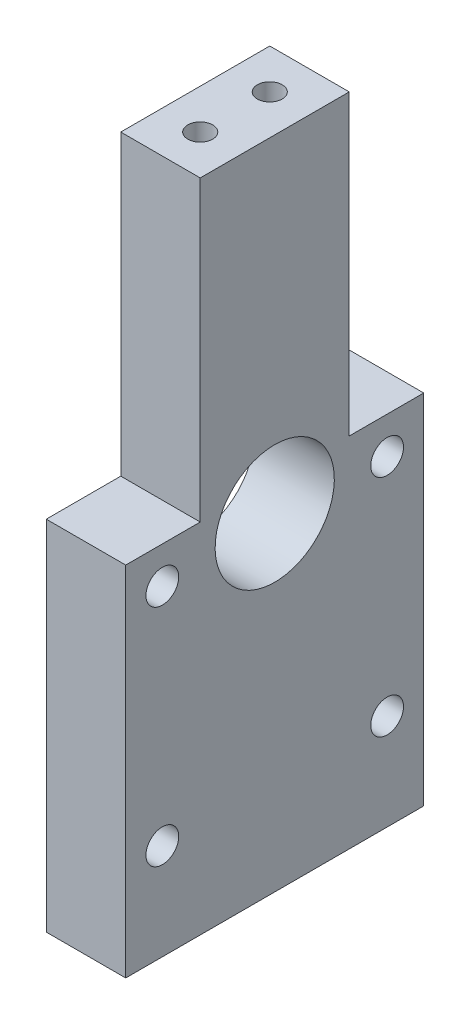
ISO-10303-21;
HEADER;
FILE_DESCRIPTION(('STEP AP214'),'2;1');
FILE_NAME('part.step','',(''),(''),'','','');
FILE_SCHEMA(('AUTOMOTIVE_DESIGN { 1 0 10303 214 1 1 1 1 }'));
ENDSEC;
DATA;
#1=APPLICATION_CONTEXT('core data for automotive mechanical design processes');
#2=APPLICATION_PROTOCOL_DEFINITION('international standard','automotive_design',2000,#1);
#3=PRODUCT_CONTEXT('',#1,'mechanical');
#4=PRODUCT('Part','Part','',(#3));
#5=PRODUCT_RELATED_PRODUCT_CATEGORY('part','',(#4));
#6=PRODUCT_DEFINITION_FORMATION('','',#4);
#7=PRODUCT_DEFINITION_CONTEXT('part definition',#1,'design');
#8=PRODUCT_DEFINITION('design','',#6,#7);
#9=PRODUCT_DEFINITION_SHAPE('','',#8);
#10=(LENGTH_UNIT() NAMED_UNIT(*) SI_UNIT(.MILLI.,.METRE.));
#11=(NAMED_UNIT(*) PLANE_ANGLE_UNIT() SI_UNIT($,.RADIAN.));
#12=(NAMED_UNIT(*) SI_UNIT($,.STERADIAN.) SOLID_ANGLE_UNIT());
#13=UNCERTAINTY_MEASURE_WITH_UNIT(LENGTH_MEASURE(1.E-05),#10,'distance_accuracy_value','');
#14=(GEOMETRIC_REPRESENTATION_CONTEXT(3) GLOBAL_UNCERTAINTY_ASSIGNED_CONTEXT((#13)) GLOBAL_UNIT_ASSIGNED_CONTEXT((#10,
#11,#12)) REPRESENTATION_CONTEXT('',''));
#15=CARTESIAN_POINT('',(0.,0.,0.));
#16=DIRECTION('',(0.,0.,1.));
#17=DIRECTION('',(1.,0.,0.));
#18=AXIS2_PLACEMENT_3D('',#15,#16,#17);
#19=CARTESIAN_POINT('',(0.,0.,30.));
#20=DIRECTION('',(0.,0.,1.));
#21=DIRECTION('',(1.,0.,0.));
#22=AXIS2_PLACEMENT_3D('',#19,#20,#21);
#23=PLANE('',#22);
#24=DIRECTION('',(0.,1.,0.));
#25=VECTOR('',#24,1.);
#26=CARTESIAN_POINT('',(18.,-11.,30.));
#27=LINE('',#26,#25);
#28=CARTESIAN_POINT('',(18.,-77.,30.));
#29=VERTEX_POINT('',#28);
#30=CARTESIAN_POINT('',(18.,-41.,30.));
#31=VERTEX_POINT('',#30);
#32=EDGE_CURVE('E213',#29,#31,#27,.T.);
#33=ORIENTED_EDGE('',*,*,#32,.T.);
#34=DIRECTION('',(1.,0.,0.));
#35=VECTOR('',#34,1.);
#36=CARTESIAN_POINT('',(18.,-41.,30.));
#37=LINE('',#36,#35);
#38=CARTESIAN_POINT('',(10.,-41.,30.));
#39=VERTEX_POINT('',#38);
#40=EDGE_CURVE('E156',#39,#31,#37,.T.);
#41=ORIENTED_EDGE('',*,*,#40,.F.);
#42=DIRECTION('',(0.,-1.,0.));
#43=VECTOR('',#42,1.);
#44=CARTESIAN_POINT('',(10.,-11.,30.));
#45=LINE('',#44,#43);
#46=CARTESIAN_POINT('',(10.,-77.,30.));
#47=VERTEX_POINT('',#46);
#48=EDGE_CURVE('E208',#39,#47,#45,.T.);
#49=ORIENTED_EDGE('',*,*,#48,.T.);
#50=DIRECTION('',(1.,0.,0.));
#51=VECTOR('',#50,1.);
#52=CARTESIAN_POINT('',(10.,-77.,30.));
#53=LINE('',#52,#51);
#54=EDGE_CURVE('E210',#47,#29,#53,.T.);
#55=ORIENTED_EDGE('',*,*,#54,.T.);
#56=EDGE_LOOP('',(#33,#41,#49,#55));
#57=FACE_BOUND('',#56,.T.);
#58=ADVANCED_FACE('F44',(#57),#23,.T.);
#59=CARTESIAN_POINT('',(0.,0.,0.));
#60=DIRECTION('',(0.,0.,1.));
#61=DIRECTION('',(1.,0.,0.));
#62=AXIS2_PLACEMENT_3D('',#59,#60,#61);
#63=PLANE('',#62);
#64=DIRECTION('',(-1.,0.,0.));
#65=VECTOR('',#64,1.);
#66=CARTESIAN_POINT('',(10.,-41.,0.));
#67=LINE('',#66,#65);
#68=CARTESIAN_POINT('',(18.,-41.,0.));
#69=VERTEX_POINT('',#68);
#70=CARTESIAN_POINT('',(10.,-41.,0.));
#71=VERTEX_POINT('',#70);
#72=EDGE_CURVE('E134',#69,#71,#67,.T.);
#73=ORIENTED_EDGE('',*,*,#72,.F.);
#74=DIRECTION('',(0.,1.,0.));
#75=VECTOR('',#74,1.);
#76=CARTESIAN_POINT('',(18.,-11.,0.));
#77=LINE('',#76,#75);
#78=CARTESIAN_POINT('',(18.,-77.,0.));
#79=VERTEX_POINT('',#78);
#80=EDGE_CURVE('E211',#79,#69,#77,.T.);
#81=ORIENTED_EDGE('',*,*,#80,.F.);
#82=DIRECTION('',(1.,0.,0.));
#83=VECTOR('',#82,1.);
#84=CARTESIAN_POINT('',(10.,-77.,0.));
#85=LINE('',#84,#83);
#86=CARTESIAN_POINT('',(10.,-77.,0.));
#87=VERTEX_POINT('',#86);
#88=EDGE_CURVE('E218',#87,#79,#85,.T.);
#89=ORIENTED_EDGE('',*,*,#88,.F.);
#90=DIRECTION('',(0.,-1.,0.));
#91=VECTOR('',#90,1.);
#92=CARTESIAN_POINT('',(10.,-11.,0.));
#93=LINE('',#92,#91);
#94=EDGE_CURVE('E216',#71,#87,#93,.T.);
#95=ORIENTED_EDGE('',*,*,#94,.F.);
#96=EDGE_LOOP('',(#73,#81,#89,#95));
#97=FACE_BOUND('',#96,.T.);
#98=ADVANCED_FACE('F237',(#97),#63,.F.);
#99=CARTESIAN_POINT('',(10.,-11.,30.));
#100=DIRECTION('',(1.,0.,0.));
#101=DIRECTION('',(0.,1.,0.));
#102=AXIS2_PLACEMENT_3D('',#99,#100,#101);
#103=PLANE('',#102);
#104=CARTESIAN_POINT('',(10.,-44.,15.));
#105=DIRECTION('',(1.,0.,0.));
#106=DIRECTION('',(0.,1.,0.));
#107=AXIS2_PLACEMENT_3D('',#104,#105,#106);
#108=CIRCLE('',#107,6.);
#109=CARTESIAN_POINT('',(10.,-38.,15.));
#110=VERTEX_POINT('',#109);
#111=EDGE_CURVE('E160',#110,#110,#108,.T.);
#112=ORIENTED_EDGE('',*,*,#111,.T.);
#113=EDGE_LOOP('',(#112));
#114=FACE_BOUND('',#113,.T.);
#115=CARTESIAN_POINT('',(10.,-44.6862915010152,3.68629150101527));
#116=DIRECTION('',(1.,0.,0.));
#117=DIRECTION('',(0.,1.,0.));
#118=AXIS2_PLACEMENT_3D('',#115,#116,#117);
#119=CIRCLE('',#118,1.65);
#120=CARTESIAN_POINT('',(10.,-43.0362915010152,3.68629150101527));
#121=VERTEX_POINT('',#120);
#122=EDGE_CURVE('E190',#121,#121,#119,.T.);
#123=ORIENTED_EDGE('',*,*,#122,.T.);
#124=EDGE_LOOP('',(#123));
#125=FACE_BOUND('',#124,.T.);
#126=CARTESIAN_POINT('',(10.,-67.3137084989848,3.68629150101527));
#127=DIRECTION('',(1.,0.,0.));
#128=DIRECTION('',(0.,1.,0.));
#129=AXIS2_PLACEMENT_3D('',#126,#127,#128);
#130=CIRCLE('',#129,1.64999999999999);
#131=CARTESIAN_POINT('',(10.,-65.6637084989848,3.68629150101527));
#132=VERTEX_POINT('',#131);
#133=EDGE_CURVE('E196',#132,#132,#130,.T.);
#134=ORIENTED_EDGE('',*,*,#133,.T.);
#135=EDGE_LOOP('',(#134));
#136=FACE_BOUND('',#135,.T.);
#137=CARTESIAN_POINT('',(10.,-67.3137084989848,26.3137084989847));
#138=DIRECTION('',(1.,0.,0.));
#139=DIRECTION('',(0.,1.,0.));
#140=AXIS2_PLACEMENT_3D('',#137,#138,#139);
#141=CIRCLE('',#140,1.64999999999999);
#142=CARTESIAN_POINT('',(10.,-65.6637084989848,26.3137084989847));
#143=VERTEX_POINT('',#142);
#144=EDGE_CURVE('E202',#143,#143,#141,.T.);
#145=ORIENTED_EDGE('',*,*,#144,.T.);
#146=EDGE_LOOP('',(#145));
#147=FACE_BOUND('',#146,.T.);
#148=CARTESIAN_POINT('',(10.,-44.6862915010152,26.3137084989847));
#149=DIRECTION('',(1.,0.,0.));
#150=DIRECTION('',(0.,1.,0.));
#151=AXIS2_PLACEMENT_3D('',#148,#149,#150);
#152=CIRCLE('',#151,1.65);
#153=CARTESIAN_POINT('',(10.,-43.0362915010152,26.3137084989847));
#154=VERTEX_POINT('',#153);
#155=EDGE_CURVE('E48',#154,#154,#152,.T.);
#156=ORIENTED_EDGE('',*,*,#155,.T.);
#157=EDGE_LOOP('',(#156));
#158=FACE_BOUND('',#157,.T.);
#159=DIRECTION('',(0.,0.,-1.));
#160=VECTOR('',#159,1.);
#161=CARTESIAN_POINT('',(10.,-11.,30.));
#162=LINE('',#161,#160);
#163=CARTESIAN_POINT('',(10.,-11.,22.5));
#164=VERTEX_POINT('',#163);
#165=CARTESIAN_POINT('',(10.,-11.,7.5));
#166=VERTEX_POINT('',#165);
#167=EDGE_CURVE('E142',#164,#166,#162,.T.);
#168=ORIENTED_EDGE('',*,*,#167,.T.);
#169=DIRECTION('',(0.,1.,0.));
#170=VECTOR('',#169,1.);
#171=CARTESIAN_POINT('',(10.,-41.,7.5));
#172=LINE('',#171,#170);
#173=CARTESIAN_POINT('',(10.,-41.,7.5));
#174=VERTEX_POINT('',#173);
#175=EDGE_CURVE('E126',#174,#166,#172,.T.);
#176=ORIENTED_EDGE('',*,*,#175,.F.);
#177=DIRECTION('',(0.,0.,1.));
#178=VECTOR('',#177,1.);
#179=CARTESIAN_POINT('',(10.,-41.,0.));
#180=LINE('',#179,#178);
#181=EDGE_CURVE('E130',#71,#174,#180,.T.);
#182=ORIENTED_EDGE('',*,*,#181,.F.);
#183=ORIENTED_EDGE('',*,*,#94,.T.);
#184=DIRECTION('',(0.,0.,-1.));
#185=VECTOR('',#184,1.);
#186=CARTESIAN_POINT('',(10.,-77.,30.));
#187=LINE('',#186,#185);
#188=EDGE_CURVE('E11',#47,#87,#187,.T.);
#189=ORIENTED_EDGE('',*,*,#188,.F.);
#190=ORIENTED_EDGE('',*,*,#48,.F.);
#191=DIRECTION('',(0.,0.,1.));
#192=VECTOR('',#191,1.);
#193=CARTESIAN_POINT('',(10.,-41.,30.));
#194=LINE('',#193,#192);
#195=CARTESIAN_POINT('',(10.,-41.,22.5));
#196=VERTEX_POINT('',#195);
#197=EDGE_CURVE('E60',#196,#39,#194,.T.);
#198=ORIENTED_EDGE('',*,*,#197,.F.);
#199=DIRECTION('',(0.,1.,0.));
#200=VECTOR('',#199,1.);
#201=CARTESIAN_POINT('',(10.,-41.,22.5));
#202=LINE('',#201,#200);
#203=EDGE_CURVE('E161',#196,#164,#202,.T.);
#204=ORIENTED_EDGE('',*,*,#203,.T.);
#205=EDGE_LOOP('',(#168,#176,#182,#183,#189,#190,#198,#204));
#206=FACE_BOUND('',#205,.T.);
#207=ADVANCED_FACE('F46',(#114,#125,#136,#147,#158,#206),#103,.F.);
#208=CARTESIAN_POINT('',(10.,-77.,30.));
#209=DIRECTION('',(0.,1.,0.));
#210=DIRECTION('',(0.,0.,1.));
#211=AXIS2_PLACEMENT_3D('',#208,#209,#210);
#212=PLANE('',#211);
#213=CARTESIAN_POINT('',(14.,-77.,20.));
#214=DIRECTION('',(0.,-1.,0.));
#215=DIRECTION('',(0.,0.,-1.));
#216=AXIS2_PLACEMENT_3D('',#213,#214,#215);
#217=CIRCLE('',#216,1.25);
#218=CARTESIAN_POINT('',(14.,-77.,18.75));
#219=VERTEX_POINT('',#218);
#220=EDGE_CURVE('E144',#219,#219,#217,.T.);
#221=ORIENTED_EDGE('',*,*,#220,.F.);
#222=EDGE_LOOP('',(#221));
#223=FACE_BOUND('',#222,.T.);
#224=CARTESIAN_POINT('',(14.,-77.,10.));
#225=DIRECTION('',(0.,-1.,0.));
#226=DIRECTION('',(0.,0.,-1.));
#227=AXIS2_PLACEMENT_3D('',#224,#225,#226);
#228=CIRCLE('',#227,1.25);
#229=CARTESIAN_POINT('',(14.,-77.,8.75));
#230=VERTEX_POINT('',#229);
#231=EDGE_CURVE('E169',#230,#230,#228,.T.);
#232=ORIENTED_EDGE('',*,*,#231,.F.);
#233=EDGE_LOOP('',(#232));
#234=FACE_BOUND('',#233,.T.);
#235=ORIENTED_EDGE('',*,*,#88,.T.);
#236=DIRECTION('',(0.,0.,-1.));
#237=VECTOR('',#236,1.);
#238=CARTESIAN_POINT('',(18.,-77.,30.));
#239=LINE('',#238,#237);
#240=EDGE_CURVE('E53',#29,#79,#239,.T.);
#241=ORIENTED_EDGE('',*,*,#240,.F.);
#242=ORIENTED_EDGE('',*,*,#54,.F.);
#243=ORIENTED_EDGE('',*,*,#188,.T.);
#244=EDGE_LOOP('',(#235,#241,#242,#243));
#245=FACE_BOUND('',#244,.T.);
#246=ADVANCED_FACE('F240',(#223,#234,#245),#212,.F.);
#247=CARTESIAN_POINT('',(18.,-11.,30.));
#248=DIRECTION('',(-1.,0.,0.));
#249=DIRECTION('',(0.,-1.,0.));
#250=AXIS2_PLACEMENT_3D('',#247,#248,#249);
#251=PLANE('',#250);
#252=CARTESIAN_POINT('',(18.,-44.,15.));
#253=DIRECTION('',(1.,0.,0.));
#254=DIRECTION('',(0.,1.,0.));
#255=AXIS2_PLACEMENT_3D('',#252,#253,#254);
#256=CIRCLE('',#255,6.);
#257=CARTESIAN_POINT('',(18.,-38.,15.));
#258=VERTEX_POINT('',#257);
#259=EDGE_CURVE('E252',#258,#258,#256,.T.);
#260=ORIENTED_EDGE('',*,*,#259,.F.);
#261=EDGE_LOOP('',(#260));
#262=FACE_BOUND('',#261,.T.);
#263=CARTESIAN_POINT('',(18.,-44.6862915010152,3.68629150101527));
#264=DIRECTION('',(1.,0.,0.));
#265=DIRECTION('',(0.,0.,-1.));
#266=AXIS2_PLACEMENT_3D('',#263,#264,#265);
#267=CIRCLE('',#266,1.64999999999999);
#268=CARTESIAN_POINT('',(18.,-44.6862915010152,2.03629150101527));
#269=VERTEX_POINT('',#268);
#270=EDGE_CURVE('E187',#269,#269,#267,.T.);
#271=ORIENTED_EDGE('',*,*,#270,.F.);
#272=EDGE_LOOP('',(#271));
#273=FACE_BOUND('',#272,.T.);
#274=CARTESIAN_POINT('',(18.,-67.3137084989848,3.68629150101527));
#275=DIRECTION('',(1.,0.,0.));
#276=DIRECTION('',(0.,0.,-1.));
#277=AXIS2_PLACEMENT_3D('',#274,#275,#276);
#278=CIRCLE('',#277,1.64999999999998);
#279=CARTESIAN_POINT('',(18.,-67.3137084989848,2.03629150101528));
#280=VERTEX_POINT('',#279);
#281=EDGE_CURVE('E193',#280,#280,#278,.T.);
#282=ORIENTED_EDGE('',*,*,#281,.F.);
#283=EDGE_LOOP('',(#282));
#284=FACE_BOUND('',#283,.T.);
#285=CARTESIAN_POINT('',(18.,-67.3137084989848,26.3137084989847));
#286=DIRECTION('',(1.,0.,0.));
#287=DIRECTION('',(0.,0.,-1.));
#288=AXIS2_PLACEMENT_3D('',#285,#286,#287);
#289=CIRCLE('',#288,1.64999999999998);
#290=CARTESIAN_POINT('',(18.,-67.3137084989848,24.6637084989848));
#291=VERTEX_POINT('',#290);
#292=EDGE_CURVE('E199',#291,#291,#289,.T.);
#293=ORIENTED_EDGE('',*,*,#292,.F.);
#294=EDGE_LOOP('',(#293));
#295=FACE_BOUND('',#294,.T.);
#296=CARTESIAN_POINT('',(18.,-44.6862915010152,26.3137084989847));
#297=DIRECTION('',(1.,0.,0.));
#298=DIRECTION('',(0.,0.,-1.));
#299=AXIS2_PLACEMENT_3D('',#296,#297,#298);
#300=CIRCLE('',#299,1.64999999999999);
#301=CARTESIAN_POINT('',(18.,-44.6862915010152,24.6637084989847));
#302=VERTEX_POINT('',#301);
#303=EDGE_CURVE('E205',#302,#302,#300,.T.);
#304=ORIENTED_EDGE('',*,*,#303,.F.);
#305=EDGE_LOOP('',(#304));
#306=FACE_BOUND('',#305,.T.);
#307=DIRECTION('',(0.,0.,-1.));
#308=VECTOR('',#307,1.);
#309=CARTESIAN_POINT('',(18.,-41.,0.));
#310=LINE('',#309,#308);
#311=CARTESIAN_POINT('',(18.,-41.,7.5));
#312=VERTEX_POINT('',#311);
#313=EDGE_CURVE('E68',#312,#69,#310,.T.);
#314=ORIENTED_EDGE('',*,*,#313,.F.);
#315=DIRECTION('',(0.,1.,0.));
#316=VECTOR('',#315,1.);
#317=CARTESIAN_POINT('',(18.,-41.,7.5));
#318=LINE('',#317,#316);
#319=CARTESIAN_POINT('',(18.,-11.,7.5));
#320=VERTEX_POINT('',#319);
#321=EDGE_CURVE('E129',#312,#320,#318,.T.);
#322=ORIENTED_EDGE('',*,*,#321,.T.);
#323=DIRECTION('',(0.,0.,-1.));
#324=VECTOR('',#323,1.);
#325=CARTESIAN_POINT('',(18.,-11.,30.));
#326=LINE('',#325,#324);
#327=CARTESIAN_POINT('',(18.,-11.,22.5));
#328=VERTEX_POINT('',#327);
#329=EDGE_CURVE('E223',#328,#320,#326,.T.);
#330=ORIENTED_EDGE('',*,*,#329,.F.);
#331=DIRECTION('',(0.,1.,0.));
#332=VECTOR('',#331,1.);
#333=CARTESIAN_POINT('',(18.,-41.,22.5));
#334=LINE('',#333,#332);
#335=CARTESIAN_POINT('',(18.,-41.,22.5));
#336=VERTEX_POINT('',#335);
#337=EDGE_CURVE('E158',#336,#328,#334,.T.);
#338=ORIENTED_EDGE('',*,*,#337,.F.);
#339=DIRECTION('',(0.,0.,-1.));
#340=VECTOR('',#339,1.);
#341=CARTESIAN_POINT('',(18.,-41.,30.));
#342=LINE('',#341,#340);
#343=EDGE_CURVE('E149',#31,#336,#342,.T.);
#344=ORIENTED_EDGE('',*,*,#343,.F.);
#345=ORIENTED_EDGE('',*,*,#32,.F.);
#346=ORIENTED_EDGE('',*,*,#240,.T.);
#347=ORIENTED_EDGE('',*,*,#80,.T.);
#348=EDGE_LOOP('',(#314,#322,#330,#338,#344,#345,#346,#347));
#349=FACE_BOUND('',#348,.T.);
#350=ADVANCED_FACE('F231',(#262,#273,#284,#295,#306,#349),#251,.F.);
#351=CARTESIAN_POINT('',(10.,-11.,30.));
#352=DIRECTION('',(0.,-1.,0.));
#353=DIRECTION('',(0.,0.,-1.));
#354=AXIS2_PLACEMENT_3D('',#351,#352,#353);
#355=PLANE('',#354);
#356=CARTESIAN_POINT('',(14.,-11.,11.5));
#357=DIRECTION('',(0.,1.,0.));
#358=DIRECTION('',(0.,0.,1.));
#359=AXIS2_PLACEMENT_3D('',#356,#357,#358);
#360=CIRCLE('',#359,1.24999999999999);
#361=CARTESIAN_POINT('',(14.,-11.,12.75));
#362=VERTEX_POINT('',#361);
#363=EDGE_CURVE('E175',#362,#362,#360,.T.);
#364=ORIENTED_EDGE('',*,*,#363,.F.);
#365=EDGE_LOOP('',(#364));
#366=FACE_BOUND('',#365,.T.);
#367=CARTESIAN_POINT('',(14.,-11.,18.5));
#368=DIRECTION('',(0.,1.,0.));
#369=DIRECTION('',(0.,0.,1.));
#370=AXIS2_PLACEMENT_3D('',#367,#368,#369);
#371=CIRCLE('',#370,1.24999999999999);
#372=CARTESIAN_POINT('',(14.,-11.,19.75));
#373=VERTEX_POINT('',#372);
#374=EDGE_CURVE('E181',#373,#373,#371,.T.);
#375=ORIENTED_EDGE('',*,*,#374,.F.);
#376=EDGE_LOOP('',(#375));
#377=FACE_BOUND('',#376,.T.);
#378=ORIENTED_EDGE('',*,*,#329,.T.);
#379=DIRECTION('',(1.,0.,0.));
#380=VECTOR('',#379,1.);
#381=CARTESIAN_POINT('',(10.,-11.,7.5));
#382=LINE('',#381,#380);
#383=EDGE_CURVE('E137',#166,#320,#382,.T.);
#384=ORIENTED_EDGE('',*,*,#383,.F.);
#385=ORIENTED_EDGE('',*,*,#167,.F.);
#386=DIRECTION('',(-1.,0.,0.));
#387=VECTOR('',#386,1.);
#388=CARTESIAN_POINT('',(18.,-11.,22.5));
#389=LINE('',#388,#387);
#390=EDGE_CURVE('E153',#328,#164,#389,.T.);
#391=ORIENTED_EDGE('',*,*,#390,.F.);
#392=EDGE_LOOP('',(#378,#384,#385,#391));
#393=FACE_BOUND('',#392,.T.);
#394=ADVANCED_FACE('F249',(#366,#377,#393),#355,.F.);
#395=CARTESIAN_POINT('',(18.,-44.6862915010152,26.3137084989847));
#396=DIRECTION('',(1.,0.,0.));
#397=DIRECTION('',(0.,0.,-1.));
#398=AXIS2_PLACEMENT_3D('',#395,#396,#397);
#399=CYLINDRICAL_SURFACE('',#398,1.65);
#400=ORIENTED_EDGE('',*,*,#303,.T.);
#401=EDGE_LOOP('',(#400));
#402=FACE_BOUND('',#401,.T.);
#403=ORIENTED_EDGE('',*,*,#155,.F.);
#404=EDGE_LOOP('',(#403));
#405=FACE_BOUND('',#404,.T.);
#406=ADVANCED_FACE('F277',(#402,#405),#399,.F.);
#407=CARTESIAN_POINT('',(18.,-67.3137084989848,26.3137084989847));
#408=DIRECTION('',(1.,0.,0.));
#409=DIRECTION('',(0.,0.,-1.));
#410=AXIS2_PLACEMENT_3D('',#407,#408,#409);
#411=CYLINDRICAL_SURFACE('',#410,1.64999999999999);
#412=ORIENTED_EDGE('',*,*,#292,.T.);
#413=EDGE_LOOP('',(#412));
#414=FACE_BOUND('',#413,.T.);
#415=ORIENTED_EDGE('',*,*,#144,.F.);
#416=EDGE_LOOP('',(#415));
#417=FACE_BOUND('',#416,.T.);
#418=ADVANCED_FACE('F280',(#414,#417),#411,.F.);
#419=CARTESIAN_POINT('',(18.,-67.3137084989848,3.68629150101527));
#420=DIRECTION('',(1.,0.,0.));
#421=DIRECTION('',(0.,0.,-1.));
#422=AXIS2_PLACEMENT_3D('',#419,#420,#421);
#423=CYLINDRICAL_SURFACE('',#422,1.64999999999999);
#424=ORIENTED_EDGE('',*,*,#281,.T.);
#425=EDGE_LOOP('',(#424));
#426=FACE_BOUND('',#425,.T.);
#427=ORIENTED_EDGE('',*,*,#133,.F.);
#428=EDGE_LOOP('',(#427));
#429=FACE_BOUND('',#428,.T.);
#430=ADVANCED_FACE('F327',(#426,#429),#423,.F.);
#431=CARTESIAN_POINT('',(18.,-44.6862915010152,3.68629150101527));
#432=DIRECTION('',(1.,0.,0.));
#433=DIRECTION('',(0.,0.,-1.));
#434=AXIS2_PLACEMENT_3D('',#431,#432,#433);
#435=CYLINDRICAL_SURFACE('',#434,1.65);
#436=ORIENTED_EDGE('',*,*,#270,.T.);
#437=EDGE_LOOP('',(#436));
#438=FACE_BOUND('',#437,.T.);
#439=ORIENTED_EDGE('',*,*,#122,.F.);
#440=EDGE_LOOP('',(#439));
#441=FACE_BOUND('',#440,.T.);
#442=ADVANCED_FACE('F319',(#438,#441),#435,.F.);
#443=CARTESIAN_POINT('',(14.,-21.5,18.5));
#444=DIRECTION('',(0.,1.,0.));
#445=DIRECTION('',(0.,0.,1.));
#446=AXIS2_PLACEMENT_3D('',#443,#444,#445);
#447=CONICAL_SURFACE('',#446,1.25,1.02974425867665);
#448=CARTESIAN_POINT('',(14.,-22.2510757737845,18.5));
#449=VERTEX_POINT('',#448);
#450=VERTEX_LOOP('',#449);
#451=FACE_BOUND('',#450,.T.);
#452=CARTESIAN_POINT('',(14.,-21.5,18.5));
#453=DIRECTION('',(0.,1.,0.));
#454=DIRECTION('',(0.,0.,1.));
#455=AXIS2_PLACEMENT_3D('',#452,#453,#454);
#456=CIRCLE('',#455,1.25);
#457=CARTESIAN_POINT('',(14.,-21.5,19.75));
#458=VERTEX_POINT('',#457);
#459=EDGE_CURVE('E184',#458,#458,#456,.T.);
#460=ORIENTED_EDGE('',*,*,#459,.T.);
#461=EDGE_LOOP('',(#460));
#462=FACE_BOUND('',#461,.T.);
#463=ADVANCED_FACE('F309',(#451,#462),#447,.F.);
#464=CARTESIAN_POINT('',(14.,-11.,18.5));
#465=DIRECTION('',(0.,1.,0.));
#466=DIRECTION('',(0.,0.,1.));
#467=AXIS2_PLACEMENT_3D('',#464,#465,#466);
#468=CYLINDRICAL_SURFACE('',#467,1.24999999999999);
#469=ORIENTED_EDGE('',*,*,#459,.F.);
#470=EDGE_LOOP('',(#469));
#471=FACE_BOUND('',#470,.T.);
#472=ORIENTED_EDGE('',*,*,#374,.T.);
#473=EDGE_LOOP('',(#472));
#474=FACE_BOUND('',#473,.T.);
#475=ADVANCED_FACE('F306',(#471,#474),#468,.F.);
#476=CARTESIAN_POINT('',(14.,-21.5,11.5));
#477=DIRECTION('',(0.,1.,0.));
#478=DIRECTION('',(0.,0.,1.));
#479=AXIS2_PLACEMENT_3D('',#476,#477,#478);
#480=CONICAL_SURFACE('',#479,1.25,1.02974425867665);
#481=CARTESIAN_POINT('',(14.,-22.2510757737845,11.5));
#482=VERTEX_POINT('',#481);
#483=VERTEX_LOOP('',#482);
#484=FACE_BOUND('',#483,.T.);
#485=CARTESIAN_POINT('',(14.,-21.5,11.5));
#486=DIRECTION('',(0.,1.,0.));
#487=DIRECTION('',(0.,0.,1.));
#488=AXIS2_PLACEMENT_3D('',#485,#486,#487);
#489=CIRCLE('',#488,1.25);
#490=CARTESIAN_POINT('',(14.,-21.5,12.75));
#491=VERTEX_POINT('',#490);
#492=EDGE_CURVE('E178',#491,#491,#489,.T.);
#493=ORIENTED_EDGE('',*,*,#492,.T.);
#494=EDGE_LOOP('',(#493));
#495=FACE_BOUND('',#494,.T.);
#496=ADVANCED_FACE('F308',(#484,#495),#480,.F.);
#497=CARTESIAN_POINT('',(14.,-11.,11.5));
#498=DIRECTION('',(0.,1.,0.));
#499=DIRECTION('',(0.,0.,1.));
#500=AXIS2_PLACEMENT_3D('',#497,#498,#499);
#501=CYLINDRICAL_SURFACE('',#500,1.24999999999999);
#502=ORIENTED_EDGE('',*,*,#492,.F.);
#503=EDGE_LOOP('',(#502));
#504=FACE_BOUND('',#503,.T.);
#505=ORIENTED_EDGE('',*,*,#363,.T.);
#506=EDGE_LOOP('',(#505));
#507=FACE_BOUND('',#506,.T.);
#508=ADVANCED_FACE('F316',(#504,#507),#501,.F.);
#509=CARTESIAN_POINT('',(14.,-58.5,10.));
#510=DIRECTION('',(0.,-1.,0.));
#511=DIRECTION('',(0.,0.,-1.));
#512=AXIS2_PLACEMENT_3D('',#509,#510,#511);
#513=CONICAL_SURFACE('',#512,1.25,1.02974425867666);
#514=CARTESIAN_POINT('',(14.,-57.7489242262155,10.));
#515=VERTEX_POINT('',#514);
#516=VERTEX_LOOP('',#515);
#517=FACE_BOUND('',#516,.T.);
#518=CARTESIAN_POINT('',(14.,-58.5,10.));
#519=DIRECTION('',(0.,-1.,0.));
#520=DIRECTION('',(0.,0.,-1.));
#521=AXIS2_PLACEMENT_3D('',#518,#519,#520);
#522=CIRCLE('',#521,1.25);
#523=CARTESIAN_POINT('',(14.,-58.5,8.75));
#524=VERTEX_POINT('',#523);
#525=EDGE_CURVE('E172',#524,#524,#522,.T.);
#526=ORIENTED_EDGE('',*,*,#525,.T.);
#527=EDGE_LOOP('',(#526));
#528=FACE_BOUND('',#527,.T.);
#529=ADVANCED_FACE('F381',(#517,#528),#513,.F.);
#530=CARTESIAN_POINT('',(14.,-77.,10.));
#531=DIRECTION('',(0.,-1.,0.));
#532=DIRECTION('',(0.,0.,-1.));
#533=AXIS2_PLACEMENT_3D('',#530,#531,#532);
#534=CYLINDRICAL_SURFACE('',#533,1.25);
#535=ORIENTED_EDGE('',*,*,#525,.F.);
#536=EDGE_LOOP('',(#535));
#537=FACE_BOUND('',#536,.T.);
#538=ORIENTED_EDGE('',*,*,#231,.T.);
#539=EDGE_LOOP('',(#538));
#540=FACE_BOUND('',#539,.T.);
#541=ADVANCED_FACE('F404',(#537,#540),#534,.F.);
#542=CARTESIAN_POINT('',(14.,-58.5,20.));
#543=DIRECTION('',(0.,-1.,0.));
#544=DIRECTION('',(0.,0.,-1.));
#545=AXIS2_PLACEMENT_3D('',#542,#543,#544);
#546=CONICAL_SURFACE('',#545,1.25,1.02974425867666);
#547=CARTESIAN_POINT('',(14.,-57.7489242262155,20.));
#548=VERTEX_POINT('',#547);
#549=VERTEX_LOOP('',#548);
#550=FACE_BOUND('',#549,.T.);
#551=CARTESIAN_POINT('',(14.,-58.5,20.));
#552=DIRECTION('',(0.,-1.,0.));
#553=DIRECTION('',(0.,0.,-1.));
#554=AXIS2_PLACEMENT_3D('',#551,#552,#553);
#555=CIRCLE('',#554,1.25);
#556=CARTESIAN_POINT('',(14.,-58.5,18.75));
#557=VERTEX_POINT('',#556);
#558=EDGE_CURVE('E166',#557,#557,#555,.T.);
#559=ORIENTED_EDGE('',*,*,#558,.T.);
#560=EDGE_LOOP('',(#559));
#561=FACE_BOUND('',#560,.T.);
#562=ADVANCED_FACE('F414',(#550,#561),#546,.F.);
#563=CARTESIAN_POINT('',(14.,-77.,20.));
#564=DIRECTION('',(0.,-1.,0.));
#565=DIRECTION('',(0.,0.,-1.));
#566=AXIS2_PLACEMENT_3D('',#563,#564,#565);
#567=CYLINDRICAL_SURFACE('',#566,1.25);
#568=ORIENTED_EDGE('',*,*,#558,.F.);
#569=EDGE_LOOP('',(#568));
#570=FACE_BOUND('',#569,.T.);
#571=ORIENTED_EDGE('',*,*,#220,.T.);
#572=EDGE_LOOP('',(#571));
#573=FACE_BOUND('',#572,.T.);
#574=ADVANCED_FACE('F425',(#570,#573),#567,.F.);
#575=CARTESIAN_POINT('',(10.,-41.,7.5));
#576=DIRECTION('',(0.,0.,1.));
#577=DIRECTION('',(1.,0.,0.));
#578=AXIS2_PLACEMENT_3D('',#575,#576,#577);
#579=PLANE('',#578);
#580=ORIENTED_EDGE('',*,*,#383,.T.);
#581=ORIENTED_EDGE('',*,*,#321,.F.);
#582=DIRECTION('',(1.,0.,0.));
#583=VECTOR('',#582,1.);
#584=CARTESIAN_POINT('',(10.,-41.,7.5));
#585=LINE('',#584,#583);
#586=EDGE_CURVE('E122',#174,#312,#585,.T.);
#587=ORIENTED_EDGE('',*,*,#586,.F.);
#588=ORIENTED_EDGE('',*,*,#175,.T.);
#589=EDGE_LOOP('',(#580,#581,#587,#588));
#590=FACE_BOUND('',#589,.T.);
#591=ADVANCED_FACE('F124',(#590),#579,.F.);
#592=CARTESIAN_POINT('',(0.,-41.,0.));
#593=DIRECTION('',(0.,1.,0.));
#594=DIRECTION('',(0.,0.,1.));
#595=AXIS2_PLACEMENT_3D('',#592,#593,#594);
#596=PLANE('',#595);
#597=ORIENTED_EDGE('',*,*,#181,.T.);
#598=ORIENTED_EDGE('',*,*,#586,.T.);
#599=ORIENTED_EDGE('',*,*,#313,.T.);
#600=ORIENTED_EDGE('',*,*,#72,.T.);
#601=EDGE_LOOP('',(#597,#598,#599,#600));
#602=FACE_BOUND('',#601,.T.);
#603=ADVANCED_FACE('F133',(#602),#596,.T.);
#604=CARTESIAN_POINT('',(18.,-41.,22.5));
#605=DIRECTION('',(0.,0.,-1.));
#606=DIRECTION('',(-1.,0.,0.));
#607=AXIS2_PLACEMENT_3D('',#604,#605,#606);
#608=PLANE('',#607);
#609=ORIENTED_EDGE('',*,*,#390,.T.);
#610=ORIENTED_EDGE('',*,*,#203,.F.);
#611=DIRECTION('',(-1.,0.,0.));
#612=VECTOR('',#611,1.);
#613=CARTESIAN_POINT('',(18.,-41.,22.5));
#614=LINE('',#613,#612);
#615=EDGE_CURVE('E152',#336,#196,#614,.T.);
#616=ORIENTED_EDGE('',*,*,#615,.F.);
#617=ORIENTED_EDGE('',*,*,#337,.T.);
#618=EDGE_LOOP('',(#609,#610,#616,#617));
#619=FACE_BOUND('',#618,.T.);
#620=ADVANCED_FACE('F247',(#619),#608,.F.);
#621=CARTESIAN_POINT('',(0.,-41.,0.));
#622=DIRECTION('',(0.,1.,0.));
#623=DIRECTION('',(0.,0.,1.));
#624=AXIS2_PLACEMENT_3D('',#621,#622,#623);
#625=PLANE('',#624);
#626=ORIENTED_EDGE('',*,*,#343,.T.);
#627=ORIENTED_EDGE('',*,*,#615,.T.);
#628=ORIENTED_EDGE('',*,*,#197,.T.);
#629=ORIENTED_EDGE('',*,*,#40,.T.);
#630=EDGE_LOOP('',(#626,#627,#628,#629));
#631=FACE_BOUND('',#630,.T.);
#632=ADVANCED_FACE('F242',(#631),#625,.T.);
#633=CARTESIAN_POINT('',(10.,-44.,15.));
#634=DIRECTION('',(1.,0.,0.));
#635=DIRECTION('',(0.,1.,0.));
#636=AXIS2_PLACEMENT_3D('',#633,#634,#635);
#637=CYLINDRICAL_SURFACE('',#636,6.);
#638=ORIENTED_EDGE('',*,*,#111,.F.);
#639=EDGE_LOOP('',(#638));
#640=FACE_BOUND('',#639,.T.);
#641=ORIENTED_EDGE('',*,*,#259,.T.);
#642=EDGE_LOOP('',(#641));
#643=FACE_BOUND('',#642,.T.);
#644=ADVANCED_FACE('F260',(#640,#643),#637,.F.);
#645=CLOSED_SHELL('',(#58,#98,#207,#246,#350,#394,#406,#418,#430,#442,#463,#475,#496,#508,#529,
#541,#562,#574,#591,#603,#620,#632,#644));
#646=MANIFOLD_SOLID_BREP('B2',#645);
#647=ADVANCED_BREP_SHAPE_REPRESENTATION('',(#18,#646),#14);
#648=SHAPE_DEFINITION_REPRESENTATION(#9,#647);
ENDSEC;
END-ISO-10303-21;
